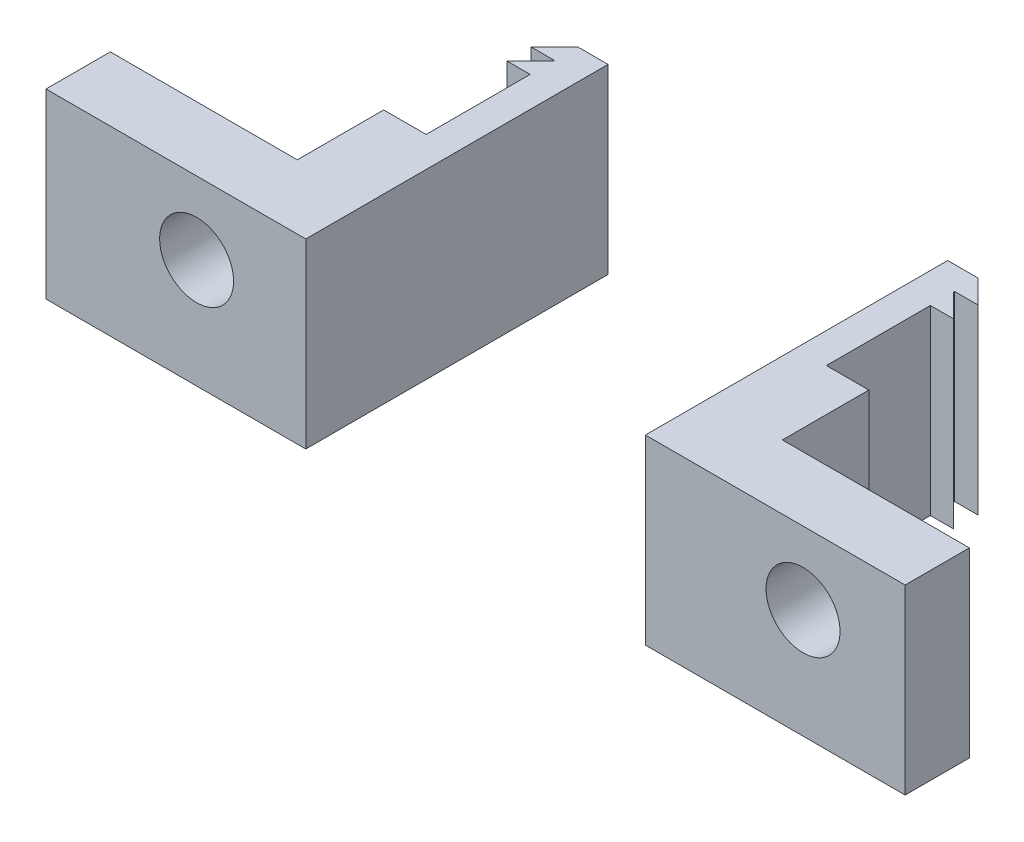
ISO-10303-21;
HEADER;
FILE_DESCRIPTION(('STEP AP214'),'2;1');
FILE_NAME('part.step','',(''),(''),'','','');
FILE_SCHEMA(('AUTOMOTIVE_DESIGN { 1 0 10303 214 1 1 1 1 }'));
ENDSEC;
DATA;
#1=APPLICATION_CONTEXT('core data for automotive mechanical design processes');
#2=APPLICATION_PROTOCOL_DEFINITION('international standard','automotive_design',2000,#1);
#3=PRODUCT_CONTEXT('',#1,'mechanical');
#4=PRODUCT('Part','Part','',(#3));
#5=PRODUCT_RELATED_PRODUCT_CATEGORY('part','',(#4));
#6=PRODUCT_DEFINITION_FORMATION('','',#4);
#7=PRODUCT_DEFINITION_CONTEXT('part definition',#1,'design');
#8=PRODUCT_DEFINITION('design','',#6,#7);
#9=PRODUCT_DEFINITION_SHAPE('','',#8);
#10=(LENGTH_UNIT() NAMED_UNIT(*) SI_UNIT(.MILLI.,.METRE.));
#11=(NAMED_UNIT(*) PLANE_ANGLE_UNIT() SI_UNIT($,.RADIAN.));
#12=(NAMED_UNIT(*) SI_UNIT($,.STERADIAN.) SOLID_ANGLE_UNIT());
#13=UNCERTAINTY_MEASURE_WITH_UNIT(LENGTH_MEASURE(1.E-05),#10,'distance_accuracy_value','');
#14=(GEOMETRIC_REPRESENTATION_CONTEXT(3) GLOBAL_UNCERTAINTY_ASSIGNED_CONTEXT((#13)) GLOBAL_UNIT_ASSIGNED_CONTEXT((#10,
#11,#12)) REPRESENTATION_CONTEXT('',''));
#15=CARTESIAN_POINT('',(0.,0.,0.));
#16=DIRECTION('',(0.,0.,1.));
#17=DIRECTION('',(1.,0.,0.));
#18=AXIS2_PLACEMENT_3D('',#15,#16,#17);
#19=CARTESIAN_POINT('',(16.5,15.,35.6989528795811));
#20=DIRECTION('',(-1.,0.,0.));
#21=DIRECTION('',(0.,0.,1.));
#22=AXIS2_PLACEMENT_3D('',#19,#20,#21);
#23=PLANE('',#22);
#24=DIRECTION('',(0.,-1.,0.));
#25=VECTOR('',#24,1.);
#26=CARTESIAN_POINT('',(16.5,15.,28.575));
#27=LINE('',#26,#25);
#28=CARTESIAN_POINT('',(16.5,15.,28.575));
#29=VERTEX_POINT('',#28);
#30=CARTESIAN_POINT('',(16.5,0.,28.575));
#31=VERTEX_POINT('',#30);
#32=EDGE_CURVE('E281',#29,#31,#27,.T.);
#33=ORIENTED_EDGE('',*,*,#32,.F.);
#34=DIRECTION('',(0.,0.,-1.));
#35=VECTOR('',#34,1.);
#36=CARTESIAN_POINT('',(16.5,15.,35.6989528795811));
#37=LINE('',#36,#35);
#38=CARTESIAN_POINT('',(16.5,15.,35.6989528795811));
#39=VERTEX_POINT('',#38);
#40=EDGE_CURVE('E239',#39,#29,#37,.T.);
#41=ORIENTED_EDGE('',*,*,#40,.F.);
#42=DIRECTION('',(0.,-1.,0.));
#43=VECTOR('',#42,1.);
#44=CARTESIAN_POINT('',(16.5,15.,35.6989528795811));
#45=LINE('',#44,#43);
#46=CARTESIAN_POINT('',(16.5,0.,35.6989528795811));
#47=VERTEX_POINT('',#46);
#48=EDGE_CURVE('E262',#39,#47,#45,.T.);
#49=ORIENTED_EDGE('',*,*,#48,.T.);
#50=DIRECTION('',(0.,0.,-1.));
#51=VECTOR('',#50,1.);
#52=CARTESIAN_POINT('',(16.5,0.,35.6989528795811));
#53=LINE('',#52,#51);
#54=EDGE_CURVE('E256',#47,#31,#53,.T.);
#55=ORIENTED_EDGE('',*,*,#54,.T.);
#56=EDGE_LOOP('',(#33,#41,#49,#55));
#57=FACE_BOUND('',#56,.T.);
#58=ADVANCED_FACE('F135',(#57),#23,.F.);
#59=CARTESIAN_POINT('',(0.,15.,0.));
#60=DIRECTION('',(0.,-1.,0.));
#61=DIRECTION('',(0.,0.,-1.));
#62=AXIS2_PLACEMENT_3D('',#59,#60,#61);
#63=PLANE('',#62);
#64=DIRECTION('',(-1.,0.,0.));
#65=VECTOR('',#64,1.);
#66=CARTESIAN_POINT('',(0.,15.,28.575));
#67=LINE('',#66,#65);
#68=CARTESIAN_POINT('',(13.,15.,28.575));
#69=VERTEX_POINT('',#68);
#70=EDGE_CURVE('E253',#29,#69,#67,.T.);
#71=ORIENTED_EDGE('',*,*,#70,.T.);
#72=DIRECTION('',(0.,0.,1.));
#73=VECTOR('',#72,1.);
#74=CARTESIAN_POINT('',(12.9999999999999,15.,20.));
#75=LINE('',#74,#73);
#76=CARTESIAN_POINT('',(12.9999999999999,15.,20.));
#77=VERTEX_POINT('',#76);
#78=EDGE_CURVE('E229',#77,#69,#75,.T.);
#79=ORIENTED_EDGE('',*,*,#78,.F.);
#80=DIRECTION('',(-1.,0.,0.));
#81=VECTOR('',#80,1.);
#82=CARTESIAN_POINT('',(14.9249999999999,15.,20.));
#83=LINE('',#82,#81);
#84=CARTESIAN_POINT('',(14.9249999999999,15.,20.));
#85=VERTEX_POINT('',#84);
#86=EDGE_CURVE('E225',#85,#77,#83,.T.);
#87=ORIENTED_EDGE('',*,*,#86,.F.);
#88=DIRECTION('',(0.707106781186564,0.,0.707106781186531));
#89=VECTOR('',#88,1.);
#90=CARTESIAN_POINT('',(13.,15.,18.0750000000002));
#91=LINE('',#90,#89);
#92=CARTESIAN_POINT('',(13.,15.,18.0750000000002));
#93=VERTEX_POINT('',#92);
#94=EDGE_CURVE('E287',#93,#85,#91,.T.);
#95=ORIENTED_EDGE('',*,*,#94,.F.);
#96=DIRECTION('',(1.06396373192931E-12,0.,1.));
#97=VECTOR('',#96,1.);
#98=CARTESIAN_POINT('',(12.9999999999999,15.,18.));
#99=LINE('',#98,#97);
#100=CARTESIAN_POINT('',(12.9999999999999,15.,18.));
#101=VERTEX_POINT('',#100);
#102=EDGE_CURVE('E290',#101,#93,#99,.T.);
#103=ORIENTED_EDGE('',*,*,#102,.F.);
#104=DIRECTION('',(-1.,0.,0.));
#105=VECTOR('',#104,1.);
#106=CARTESIAN_POINT('',(14.9249999999999,15.,18.));
#107=LINE('',#106,#105);
#108=CARTESIAN_POINT('',(14.9249999999999,15.,18.));
#109=VERTEX_POINT('',#108);
#110=EDGE_CURVE('E293',#109,#101,#107,.T.);
#111=ORIENTED_EDGE('',*,*,#110,.F.);
#112=DIRECTION('',(0.707106781186563,0.,0.707106781186532));
#113=VECTOR('',#112,1.);
#114=CARTESIAN_POINT('',(13.,15.,16.0750000000002));
#115=LINE('',#114,#113);
#116=CARTESIAN_POINT('',(13.,15.,16.0750000000002));
#117=VERTEX_POINT('',#116);
#118=EDGE_CURVE('E145',#117,#109,#115,.T.);
#119=ORIENTED_EDGE('',*,*,#118,.F.);
#120=DIRECTION('',(1.,0.,0.));
#121=VECTOR('',#120,1.);
#122=CARTESIAN_POINT('',(-20.,15.,16.0750000000002));
#123=LINE('',#122,#121);
#124=CARTESIAN_POINT('',(10.5,15.,16.0750000000002));
#125=VERTEX_POINT('',#124);
#126=EDGE_CURVE('E139',#125,#117,#123,.T.);
#127=ORIENTED_EDGE('',*,*,#126,.F.);
#128=DIRECTION('',(0.,0.,-1.));
#129=VECTOR('',#128,1.);
#130=CARTESIAN_POINT('',(10.5,15.,41.));
#131=LINE('',#130,#129);
#132=CARTESIAN_POINT('',(10.5,15.,41.));
#133=VERTEX_POINT('',#132);
#134=EDGE_CURVE('E379',#133,#125,#131,.T.);
#135=ORIENTED_EDGE('',*,*,#134,.F.);
#136=DIRECTION('',(1.,0.,0.));
#137=VECTOR('',#136,1.);
#138=CARTESIAN_POINT('',(11.5,15.,41.));
#139=LINE('',#138,#137);
#140=CARTESIAN_POINT('',(31.9173098006345,15.,41.));
#141=VERTEX_POINT('',#140);
#142=EDGE_CURVE('E255',#133,#141,#139,.T.);
#143=ORIENTED_EDGE('',*,*,#142,.T.);
#144=DIRECTION('',(0.,0.,-1.));
#145=VECTOR('',#144,1.);
#146=CARTESIAN_POINT('',(31.9173098006345,15.,41.));
#147=LINE('',#146,#145);
#148=CARTESIAN_POINT('',(31.9173098006345,15.,35.6989528795811));
#149=VERTEX_POINT('',#148);
#150=EDGE_CURVE('E259',#141,#149,#147,.T.);
#151=ORIENTED_EDGE('',*,*,#150,.T.);
#152=DIRECTION('',(-1.,0.,0.));
#153=VECTOR('',#152,1.);
#154=CARTESIAN_POINT('',(31.9173098006345,15.,35.6989528795811));
#155=LINE('',#154,#153);
#156=EDGE_CURVE('E273',#149,#39,#155,.T.);
#157=ORIENTED_EDGE('',*,*,#156,.T.);
#158=ORIENTED_EDGE('',*,*,#40,.T.);
#159=EDGE_LOOP('',(#71,#79,#87,#95,#103,#111,#119,#127,#135,#143,#151,#157,#158));
#160=FACE_BOUND('',#159,.T.);
#161=ADVANCED_FACE('F320',(#160),#63,.F.);
#162=CARTESIAN_POINT('',(0.,0.,0.));
#163=DIRECTION('',(0.,-1.,0.));
#164=DIRECTION('',(0.,0.,-1.));
#165=AXIS2_PLACEMENT_3D('',#162,#163,#164);
#166=PLANE('',#165);
#167=DIRECTION('',(0.,0.,1.));
#168=VECTOR('',#167,1.);
#169=CARTESIAN_POINT('',(12.9999999999999,0.,20.));
#170=LINE('',#169,#168);
#171=CARTESIAN_POINT('',(12.9999999999999,0.,20.));
#172=VERTEX_POINT('',#171);
#173=CARTESIAN_POINT('',(13.,0.,28.575));
#174=VERTEX_POINT('',#173);
#175=EDGE_CURVE('E233',#172,#174,#170,.T.);
#176=ORIENTED_EDGE('',*,*,#175,.T.);
#177=DIRECTION('',(1.,0.,0.));
#178=VECTOR('',#177,1.);
#179=CARTESIAN_POINT('',(0.,0.,28.575));
#180=LINE('',#179,#178);
#181=EDGE_CURVE('E238',#174,#31,#180,.T.);
#182=ORIENTED_EDGE('',*,*,#181,.T.);
#183=ORIENTED_EDGE('',*,*,#54,.F.);
#184=DIRECTION('',(-1.,0.,0.));
#185=VECTOR('',#184,1.);
#186=CARTESIAN_POINT('',(31.9173098006345,0.,35.6989528795811));
#187=LINE('',#186,#185);
#188=CARTESIAN_POINT('',(31.9173098006345,0.,35.6989528795811));
#189=VERTEX_POINT('',#188);
#190=EDGE_CURVE('E245',#189,#47,#187,.T.);
#191=ORIENTED_EDGE('',*,*,#190,.F.);
#192=DIRECTION('',(0.,0.,-1.));
#193=VECTOR('',#192,1.);
#194=CARTESIAN_POINT('',(31.9173098006345,0.,41.));
#195=LINE('',#194,#193);
#196=CARTESIAN_POINT('',(31.9173098006345,0.,41.));
#197=VERTEX_POINT('',#196);
#198=EDGE_CURVE('E397',#197,#189,#195,.T.);
#199=ORIENTED_EDGE('',*,*,#198,.F.);
#200=DIRECTION('',(1.,0.,0.));
#201=VECTOR('',#200,1.);
#202=CARTESIAN_POINT('',(11.5,0.,41.));
#203=LINE('',#202,#201);
#204=CARTESIAN_POINT('',(10.5,0.,41.));
#205=VERTEX_POINT('',#204);
#206=EDGE_CURVE('E270',#205,#197,#203,.T.);
#207=ORIENTED_EDGE('',*,*,#206,.F.);
#208=DIRECTION('',(0.,0.,1.));
#209=VECTOR('',#208,1.);
#210=CARTESIAN_POINT('',(10.5,0.,41.));
#211=LINE('',#210,#209);
#212=CARTESIAN_POINT('',(10.5,0.,16.0750000000002));
#213=VERTEX_POINT('',#212);
#214=EDGE_CURVE('E267',#213,#205,#211,.T.);
#215=ORIENTED_EDGE('',*,*,#214,.F.);
#216=DIRECTION('',(-1.,0.,0.));
#217=VECTOR('',#216,1.);
#218=CARTESIAN_POINT('',(13.,0.,16.0750000000002));
#219=LINE('',#218,#217);
#220=CARTESIAN_POINT('',(13.,0.,16.0750000000002));
#221=VERTEX_POINT('',#220);
#222=EDGE_CURVE('E306',#221,#213,#219,.T.);
#223=ORIENTED_EDGE('',*,*,#222,.F.);
#224=DIRECTION('',(0.707106781186563,0.,0.707106781186532));
#225=VECTOR('',#224,1.);
#226=CARTESIAN_POINT('',(13.,0.,16.0750000000002));
#227=LINE('',#226,#225);
#228=CARTESIAN_POINT('',(14.9249999999999,0.,18.));
#229=VERTEX_POINT('',#228);
#230=EDGE_CURVE('E153',#221,#229,#227,.T.);
#231=ORIENTED_EDGE('',*,*,#230,.T.);
#232=DIRECTION('',(-1.,0.,0.));
#233=VECTOR('',#232,1.);
#234=CARTESIAN_POINT('',(14.9249999999999,0.,18.));
#235=LINE('',#234,#233);
#236=CARTESIAN_POINT('',(12.9999999999999,0.,18.));
#237=VERTEX_POINT('',#236);
#238=EDGE_CURVE('E310',#229,#237,#235,.T.);
#239=ORIENTED_EDGE('',*,*,#238,.T.);
#240=DIRECTION('',(1.06396373192931E-12,0.,1.));
#241=VECTOR('',#240,1.);
#242=CARTESIAN_POINT('',(12.9999999999999,0.,18.));
#243=LINE('',#242,#241);
#244=CARTESIAN_POINT('',(13.,0.,18.0750000000002));
#245=VERTEX_POINT('',#244);
#246=EDGE_CURVE('E250',#237,#245,#243,.T.);
#247=ORIENTED_EDGE('',*,*,#246,.T.);
#248=DIRECTION('',(0.707106781186564,0.,0.707106781186531));
#249=VECTOR('',#248,1.);
#250=CARTESIAN_POINT('',(13.,0.,18.0750000000002));
#251=LINE('',#250,#249);
#252=CARTESIAN_POINT('',(14.9249999999999,0.,20.));
#253=VERTEX_POINT('',#252);
#254=EDGE_CURVE('E244',#245,#253,#251,.T.);
#255=ORIENTED_EDGE('',*,*,#254,.T.);
#256=DIRECTION('',(-1.,0.,0.));
#257=VECTOR('',#256,1.);
#258=CARTESIAN_POINT('',(14.9249999999999,0.,20.));
#259=LINE('',#258,#257);
#260=EDGE_CURVE('E222',#253,#172,#259,.T.);
#261=ORIENTED_EDGE('',*,*,#260,.T.);
#262=EDGE_LOOP('',(#176,#182,#183,#191,#199,#207,#215,#223,#231,#239,#247,#255,#261));
#263=FACE_BOUND('',#262,.T.);
#264=ADVANCED_FACE('F241',(#263),#166,.T.);
#265=CARTESIAN_POINT('',(31.9173098006345,15.,35.6989528795811));
#266=DIRECTION('',(0.,0.,1.));
#267=DIRECTION('',(1.,0.,0.));
#268=AXIS2_PLACEMENT_3D('',#265,#266,#267);
#269=PLANE('',#268);
#270=CARTESIAN_POINT('',(23.5,9.,35.6989528795811));
#271=DIRECTION('',(0.,0.,-1.));
#272=DIRECTION('',(-1.,0.,0.));
#273=AXIS2_PLACEMENT_3D('',#270,#271,#272);
#274=CIRCLE('',#273,3.05);
#275=CARTESIAN_POINT('',(20.45,9.,35.6989528795811));
#276=VERTEX_POINT('',#275);
#277=EDGE_CURVE('E278',#276,#276,#274,.T.);
#278=ORIENTED_EDGE('',*,*,#277,.F.);
#279=EDGE_LOOP('',(#278));
#280=FACE_BOUND('',#279,.T.);
#281=ORIENTED_EDGE('',*,*,#190,.T.);
#282=ORIENTED_EDGE('',*,*,#48,.F.);
#283=ORIENTED_EDGE('',*,*,#156,.F.);
#284=DIRECTION('',(0.,-1.,0.));
#285=VECTOR('',#284,1.);
#286=CARTESIAN_POINT('',(31.9173098006345,15.,35.6989528795811));
#287=LINE('',#286,#285);
#288=EDGE_CURVE('E248',#149,#189,#287,.T.);
#289=ORIENTED_EDGE('',*,*,#288,.T.);
#290=EDGE_LOOP('',(#281,#282,#283,#289));
#291=FACE_BOUND('',#290,.T.);
#292=ADVANCED_FACE('F327',(#280,#291),#269,.F.);
#293=CARTESIAN_POINT('',(11.5,15.,41.));
#294=DIRECTION('',(0.,0.,-1.));
#295=DIRECTION('',(-1.,0.,0.));
#296=AXIS2_PLACEMENT_3D('',#293,#294,#295);
#297=PLANE('',#296);
#298=CARTESIAN_POINT('',(23.5,9.,41.));
#299=DIRECTION('',(0.,0.,-1.));
#300=DIRECTION('',(-1.,0.,0.));
#301=AXIS2_PLACEMENT_3D('',#298,#299,#300);
#302=CIRCLE('',#301,3.05);
#303=CARTESIAN_POINT('',(20.45,9.,41.));
#304=VERTEX_POINT('',#303);
#305=EDGE_CURVE('E392',#304,#304,#302,.T.);
#306=ORIENTED_EDGE('',*,*,#305,.T.);
#307=EDGE_LOOP('',(#306));
#308=FACE_BOUND('',#307,.T.);
#309=ORIENTED_EDGE('',*,*,#206,.T.);
#310=DIRECTION('',(0.,-1.,0.));
#311=VECTOR('',#310,1.);
#312=CARTESIAN_POINT('',(31.9173098006345,15.,41.));
#313=LINE('',#312,#311);
#314=EDGE_CURVE('E282',#141,#197,#313,.T.);
#315=ORIENTED_EDGE('',*,*,#314,.F.);
#316=ORIENTED_EDGE('',*,*,#142,.F.);
#317=DIRECTION('',(0.,1.,0.));
#318=VECTOR('',#317,1.);
#319=CARTESIAN_POINT('',(10.5,0.,41.));
#320=LINE('',#319,#318);
#321=EDGE_CURVE('E375',#205,#133,#320,.T.);
#322=ORIENTED_EDGE('',*,*,#321,.F.);
#323=EDGE_LOOP('',(#309,#315,#316,#322));
#324=FACE_BOUND('',#323,.T.);
#325=ADVANCED_FACE('F358',(#308,#324),#297,.F.);
#326=CARTESIAN_POINT('',(31.9173098006345,15.,41.));
#327=DIRECTION('',(-1.,0.,0.));
#328=DIRECTION('',(0.,0.,1.));
#329=AXIS2_PLACEMENT_3D('',#326,#327,#328);
#330=PLANE('',#329);
#331=ORIENTED_EDGE('',*,*,#198,.T.);
#332=ORIENTED_EDGE('',*,*,#288,.F.);
#333=ORIENTED_EDGE('',*,*,#150,.F.);
#334=ORIENTED_EDGE('',*,*,#314,.T.);
#335=EDGE_LOOP('',(#331,#332,#333,#334));
#336=FACE_BOUND('',#335,.T.);
#337=ADVANCED_FACE('F354',(#336),#330,.F.);
#338=CARTESIAN_POINT('',(23.5,9.,50.6989528795811));
#339=DIRECTION('',(0.,0.,-1.));
#340=DIRECTION('',(-1.,0.,0.));
#341=AXIS2_PLACEMENT_3D('',#338,#339,#340);
#342=CYLINDRICAL_SURFACE('',#341,3.05);
#343=ORIENTED_EDGE('',*,*,#277,.T.);
#344=EDGE_LOOP('',(#343));
#345=FACE_BOUND('',#344,.T.);
#346=ORIENTED_EDGE('',*,*,#305,.F.);
#347=EDGE_LOOP('',(#346));
#348=FACE_BOUND('',#347,.T.);
#349=ADVANCED_FACE('F334',(#345,#348),#342,.F.);
#350=CARTESIAN_POINT('',(0.,0.,28.575));
#351=DIRECTION('',(0.,0.,-1.));
#352=DIRECTION('',(-1.,0.,0.));
#353=AXIS2_PLACEMENT_3D('',#350,#351,#352);
#354=PLANE('',#353);
#355=ORIENTED_EDGE('',*,*,#32,.T.);
#356=ORIENTED_EDGE('',*,*,#181,.F.);
#357=DIRECTION('',(0.,1.,0.));
#358=VECTOR('',#357,1.);
#359=CARTESIAN_POINT('',(13.,0.,28.575));
#360=LINE('',#359,#358);
#361=EDGE_CURVE('E235',#174,#69,#360,.T.);
#362=ORIENTED_EDGE('',*,*,#361,.T.);
#363=ORIENTED_EDGE('',*,*,#70,.F.);
#364=EDGE_LOOP('',(#355,#356,#362,#363));
#365=FACE_BOUND('',#364,.T.);
#366=ADVANCED_FACE('F331',(#365),#354,.T.);
#367=CARTESIAN_POINT('',(-20.,0.,16.0750000000002));
#368=DIRECTION('',(0.,0.,1.));
#369=DIRECTION('',(1.,0.,0.));
#370=AXIS2_PLACEMENT_3D('',#367,#368,#369);
#371=PLANE('',#370);
#372=ORIENTED_EDGE('',*,*,#126,.T.);
#373=DIRECTION('',(0.,1.,0.));
#374=VECTOR('',#373,1.);
#375=CARTESIAN_POINT('',(13.,0.,16.0750000000002));
#376=LINE('',#375,#374);
#377=EDGE_CURVE('E13',#221,#117,#376,.T.);
#378=ORIENTED_EDGE('',*,*,#377,.F.);
#379=ORIENTED_EDGE('',*,*,#222,.T.);
#380=DIRECTION('',(0.,-1.,0.));
#381=VECTOR('',#380,1.);
#382=CARTESIAN_POINT('',(10.5,0.,16.0750000000002));
#383=LINE('',#382,#381);
#384=EDGE_CURVE('E386',#125,#213,#383,.T.);
#385=ORIENTED_EDGE('',*,*,#384,.F.);
#386=EDGE_LOOP('',(#372,#378,#379,#385));
#387=FACE_BOUND('',#386,.T.);
#388=ADVANCED_FACE('F137',(#387),#371,.F.);
#389=CARTESIAN_POINT('',(12.9999999999999,0.,20.));
#390=DIRECTION('',(-1.,0.,0.));
#391=DIRECTION('',(0.,0.,1.));
#392=AXIS2_PLACEMENT_3D('',#389,#390,#391);
#393=PLANE('',#392);
#394=ORIENTED_EDGE('',*,*,#78,.T.);
#395=ORIENTED_EDGE('',*,*,#361,.F.);
#396=ORIENTED_EDGE('',*,*,#175,.F.);
#397=DIRECTION('',(0.,1.,0.));
#398=VECTOR('',#397,1.);
#399=CARTESIAN_POINT('',(12.9999999999999,0.,20.));
#400=LINE('',#399,#398);
#401=EDGE_CURVE('E218',#172,#77,#400,.T.);
#402=ORIENTED_EDGE('',*,*,#401,.T.);
#403=EDGE_LOOP('',(#394,#395,#396,#402));
#404=FACE_BOUND('',#403,.T.);
#405=ADVANCED_FACE('F234',(#404),#393,.F.);
#406=CARTESIAN_POINT('',(14.9249999999999,0.,20.));
#407=DIRECTION('',(0.,0.,-1.));
#408=DIRECTION('',(-1.,0.,0.));
#409=AXIS2_PLACEMENT_3D('',#406,#407,#408);
#410=PLANE('',#409);
#411=ORIENTED_EDGE('',*,*,#86,.T.);
#412=ORIENTED_EDGE('',*,*,#401,.F.);
#413=ORIENTED_EDGE('',*,*,#260,.F.);
#414=DIRECTION('',(0.,1.,0.));
#415=VECTOR('',#414,1.);
#416=CARTESIAN_POINT('',(14.9249999999999,0.,20.));
#417=LINE('',#416,#415);
#418=EDGE_CURVE('E285',#253,#85,#417,.T.);
#419=ORIENTED_EDGE('',*,*,#418,.T.);
#420=EDGE_LOOP('',(#411,#412,#413,#419));
#421=FACE_BOUND('',#420,.T.);
#422=ADVANCED_FACE('F220',(#421),#410,.F.);
#423=CARTESIAN_POINT('',(13.,0.,18.0750000000002));
#424=DIRECTION('',(-0.707106781186531,0.,0.707106781186564));
#425=DIRECTION('',(0.707106781186564,0.,0.707106781186531));
#426=AXIS2_PLACEMENT_3D('',#423,#424,#425);
#427=PLANE('',#426);
#428=ORIENTED_EDGE('',*,*,#94,.T.);
#429=ORIENTED_EDGE('',*,*,#418,.F.);
#430=ORIENTED_EDGE('',*,*,#254,.F.);
#431=DIRECTION('',(0.,1.,0.));
#432=VECTOR('',#431,1.);
#433=CARTESIAN_POINT('',(13.,0.,18.0750000000002));
#434=LINE('',#433,#432);
#435=EDGE_CURVE('E288',#245,#93,#434,.T.);
#436=ORIENTED_EDGE('',*,*,#435,.T.);
#437=EDGE_LOOP('',(#428,#429,#430,#436));
#438=FACE_BOUND('',#437,.T.);
#439=ADVANCED_FACE('F319',(#438),#427,.F.);
#440=CARTESIAN_POINT('',(12.9999999999999,0.,18.));
#441=DIRECTION('',(-1.,0.,1.06396373192931E-12));
#442=DIRECTION('',(1.06396373192931E-12,0.,1.));
#443=AXIS2_PLACEMENT_3D('',#440,#441,#442);
#444=PLANE('',#443);
#445=ORIENTED_EDGE('',*,*,#102,.T.);
#446=ORIENTED_EDGE('',*,*,#435,.F.);
#447=ORIENTED_EDGE('',*,*,#246,.F.);
#448=DIRECTION('',(0.,1.,0.));
#449=VECTOR('',#448,1.);
#450=CARTESIAN_POINT('',(12.9999999999999,0.,18.));
#451=LINE('',#450,#449);
#452=EDGE_CURVE('E291',#237,#101,#451,.T.);
#453=ORIENTED_EDGE('',*,*,#452,.T.);
#454=EDGE_LOOP('',(#445,#446,#447,#453));
#455=FACE_BOUND('',#454,.T.);
#456=ADVANCED_FACE('F315',(#455),#444,.F.);
#457=CARTESIAN_POINT('',(14.9249999999999,0.,18.));
#458=DIRECTION('',(0.,0.,-1.));
#459=DIRECTION('',(-1.,0.,0.));
#460=AXIS2_PLACEMENT_3D('',#457,#458,#459);
#461=PLANE('',#460);
#462=ORIENTED_EDGE('',*,*,#110,.T.);
#463=ORIENTED_EDGE('',*,*,#452,.F.);
#464=ORIENTED_EDGE('',*,*,#238,.F.);
#465=DIRECTION('',(0.,1.,0.));
#466=VECTOR('',#465,1.);
#467=CARTESIAN_POINT('',(14.9249999999999,0.,18.));
#468=LINE('',#467,#466);
#469=EDGE_CURVE('E294',#229,#109,#468,.T.);
#470=ORIENTED_EDGE('',*,*,#469,.T.);
#471=EDGE_LOOP('',(#462,#463,#464,#470));
#472=FACE_BOUND('',#471,.T.);
#473=ADVANCED_FACE('F340',(#472),#461,.F.);
#474=CARTESIAN_POINT('',(13.,0.,16.0750000000002));
#475=DIRECTION('',(-0.707106781186532,0.,0.707106781186563));
#476=DIRECTION('',(0.707106781186563,0.,0.707106781186532));
#477=AXIS2_PLACEMENT_3D('',#474,#475,#476);
#478=PLANE('',#477);
#479=ORIENTED_EDGE('',*,*,#118,.T.);
#480=ORIENTED_EDGE('',*,*,#469,.F.);
#481=ORIENTED_EDGE('',*,*,#230,.F.);
#482=ORIENTED_EDGE('',*,*,#377,.T.);
#483=EDGE_LOOP('',(#479,#480,#481,#482));
#484=FACE_BOUND('',#483,.T.);
#485=ADVANCED_FACE('F336',(#484),#478,.F.);
#486=CARTESIAN_POINT('',(10.5,0.,0.));
#487=DIRECTION('',(-1.,0.,0.));
#488=DIRECTION('',(0.,0.,1.));
#489=AXIS2_PLACEMENT_3D('',#486,#487,#488);
#490=PLANE('',#489);
#491=ORIENTED_EDGE('',*,*,#321,.T.);
#492=ORIENTED_EDGE('',*,*,#134,.T.);
#493=ORIENTED_EDGE('',*,*,#384,.T.);
#494=ORIENTED_EDGE('',*,*,#214,.T.);
#495=EDGE_LOOP('',(#491,#492,#493,#494));
#496=FACE_BOUND('',#495,.T.);
#497=ADVANCED_FACE('F339',(#496),#490,.T.);
#498=CLOSED_SHELL('',(#58,#161,#264,#292,#325,#337,#349,#366,#388,#405,#422,#439,#456,#473,#485,#497));
#499=MANIFOLD_SOLID_BREP('B2',#498);
#500=CARTESIAN_POINT('',(-23.5,15.,-5.));
#501=DIRECTION('',(1.,0.,0.));
#502=DIRECTION('',(0.,0.,-1.));
#503=AXIS2_PLACEMENT_3D('',#500,#501,#502);
#504=PLANE('',#503);
#505=DIRECTION('',(0.,0.,1.));
#506=VECTOR('',#505,1.);
#507=CARTESIAN_POINT('',(-23.5,14.1961524227066,25.6989528795811));
#508=LINE('',#507,#506);
#509=CARTESIAN_POINT('',(-23.5,14.1961524227066,35.6989528795811));
#510=VERTEX_POINT('',#509);
#511=CARTESIAN_POINT('',(-23.5,14.1961524227066,28.575));
#512=VERTEX_POINT('',#511);
#513=EDGE_CURVE('E552',#510,#512,#508,.F.);
#514=ORIENTED_EDGE('',*,*,#513,.F.);
#515=DIRECTION('',(0.,-1.,0.));
#516=VECTOR('',#515,1.);
#517=CARTESIAN_POINT('',(-23.5,15.,35.6989528795811));
#518=LINE('',#517,#516);
#519=CARTESIAN_POINT('',(-23.5,15.,35.6989528795811));
#520=VERTEX_POINT('',#519);
#521=EDGE_CURVE('E758',#520,#510,#518,.T.);
#522=ORIENTED_EDGE('',*,*,#521,.F.);
#523=DIRECTION('',(0.,0.,1.));
#524=VECTOR('',#523,1.);
#525=CARTESIAN_POINT('',(-23.5,15.,-5.));
#526=LINE('',#525,#524);
#527=CARTESIAN_POINT('',(-23.5,15.,28.575));
#528=VERTEX_POINT('',#527);
#529=EDGE_CURVE('E654',#528,#520,#526,.T.);
#530=ORIENTED_EDGE('',*,*,#529,.F.);
#531=DIRECTION('',(0.,1.,0.));
#532=VECTOR('',#531,1.);
#533=CARTESIAN_POINT('',(-23.5,15.,28.575));
#534=LINE('',#533,#532);
#535=EDGE_CURVE('E684',#512,#528,#534,.T.);
#536=ORIENTED_EDGE('',*,*,#535,.F.);
#537=EDGE_LOOP('',(#514,#522,#530,#536));
#538=FACE_BOUND('',#537,.T.);
#539=ADVANCED_FACE('F538',(#538),#504,.F.);
#540=DIRECTION('',(0.,0.,1.));
#541=VECTOR('',#540,1.);
#542=CARTESIAN_POINT('',(-23.5,3.80384757729337,25.6989528795811));
#543=LINE('',#542,#541);
#544=CARTESIAN_POINT('',(-23.5,3.80384757729337,28.575));
#545=VERTEX_POINT('',#544);
#546=CARTESIAN_POINT('',(-23.5,3.80384757729337,35.6989528795811));
#547=VERTEX_POINT('',#546);
#548=EDGE_CURVE('E678',#545,#547,#543,.T.);
#549=ORIENTED_EDGE('',*,*,#548,.F.);
#550=CARTESIAN_POINT('',(-23.5,0.,28.575));
#551=VERTEX_POINT('',#550);
#552=EDGE_CURVE('E733',#551,#545,#534,.T.);
#553=ORIENTED_EDGE('',*,*,#552,.F.);
#554=DIRECTION('',(0.,0.,1.));
#555=VECTOR('',#554,1.);
#556=CARTESIAN_POINT('',(-23.5,0.,-5.));
#557=LINE('',#556,#555);
#558=CARTESIAN_POINT('',(-23.5,0.,35.6989528795811));
#559=VERTEX_POINT('',#558);
#560=EDGE_CURVE('E747',#551,#559,#557,.T.);
#561=ORIENTED_EDGE('',*,*,#560,.T.);
#562=EDGE_CURVE('E757',#547,#559,#518,.T.);
#563=ORIENTED_EDGE('',*,*,#562,.F.);
#564=EDGE_LOOP('',(#549,#553,#561,#563));
#565=FACE_BOUND('',#564,.T.);
#566=ADVANCED_FACE('F798',(#565),#504,.F.);
#567=CARTESIAN_POINT('',(-26.5,9.,50.6989528795811));
#568=DIRECTION('',(0.,0.,-1.));
#569=DIRECTION('',(-1.,0.,0.));
#570=AXIS2_PLACEMENT_3D('',#567,#568,#569);
#571=CYLINDRICAL_SURFACE('',#570,3.05);
#572=CARTESIAN_POINT('',(-26.5,9.,35.6989528795811));
#573=DIRECTION('',(0.,0.,-1.));
#574=DIRECTION('',(-1.,0.,0.));
#575=AXIS2_PLACEMENT_3D('',#572,#573,#574);
#576=CIRCLE('',#575,3.05);
#577=CARTESIAN_POINT('',(-29.55,9.,35.6989528795811));
#578=VERTEX_POINT('',#577);
#579=EDGE_CURVE('E736',#578,#578,#576,.T.);
#580=ORIENTED_EDGE('',*,*,#579,.T.);
#581=EDGE_LOOP('',(#580));
#582=FACE_BOUND('',#581,.T.);
#583=CARTESIAN_POINT('',(-26.5,9.,41.));
#584=DIRECTION('',(0.,0.,-1.));
#585=DIRECTION('',(-1.,0.,0.));
#586=AXIS2_PLACEMENT_3D('',#583,#584,#585);
#587=CIRCLE('',#586,3.05);
#588=CARTESIAN_POINT('',(-29.55,9.,41.));
#589=VERTEX_POINT('',#588);
#590=EDGE_CURVE('E739',#589,#589,#587,.T.);
#591=ORIENTED_EDGE('',*,*,#590,.F.);
#592=EDGE_LOOP('',(#591));
#593=FACE_BOUND('',#592,.T.);
#594=ADVANCED_FACE('F827',(#582,#593),#571,.F.);
#595=CARTESIAN_POINT('',(-23.5,15.,35.6989528795811));
#596=DIRECTION('',(0.,0.,1.));
#597=DIRECTION('',(1.,0.,0.));
#598=AXIS2_PLACEMENT_3D('',#595,#596,#597);
#599=PLANE('',#598);
#600=ORIENTED_EDGE('',*,*,#521,.T.);
#601=CARTESIAN_POINT('',(-26.5,9.,35.6989528795811));
#602=DIRECTION('',(0.,0.,-1.));
#603=DIRECTION('',(-1.,0.,0.));
#604=AXIS2_PLACEMENT_3D('',#601,#602,#603);
#605=CIRCLE('',#604,5.99999999999999);
#606=EDGE_CURVE('E675',#510,#547,#605,.T.);
#607=ORIENTED_EDGE('',*,*,#606,.T.);
#608=ORIENTED_EDGE('',*,*,#562,.T.);
#609=DIRECTION('',(-1.,0.,0.));
#610=VECTOR('',#609,1.);
#611=CARTESIAN_POINT('',(-23.5,0.,35.6989528795811));
#612=LINE('',#611,#610);
#613=CARTESIAN_POINT('',(-38.9173098006345,0.,35.6989528795811));
#614=VERTEX_POINT('',#613);
#615=EDGE_CURVE('E750',#559,#614,#612,.T.);
#616=ORIENTED_EDGE('',*,*,#615,.T.);
#617=DIRECTION('',(0.,-1.,0.));
#618=VECTOR('',#617,1.);
#619=CARTESIAN_POINT('',(-38.9173098006345,15.,35.6989528795811));
#620=LINE('',#619,#618);
#621=CARTESIAN_POINT('',(-38.9173098006345,15.,35.6989528795811));
#622=VERTEX_POINT('',#621);
#623=EDGE_CURVE('E754',#622,#614,#620,.T.);
#624=ORIENTED_EDGE('',*,*,#623,.F.);
#625=DIRECTION('',(-1.,0.,0.));
#626=VECTOR('',#625,1.);
#627=CARTESIAN_POINT('',(-23.5,15.,35.6989528795811));
#628=LINE('',#627,#626);
#629=EDGE_CURVE('E741',#520,#622,#628,.T.);
#630=ORIENTED_EDGE('',*,*,#629,.F.);
#631=EDGE_LOOP('',(#600,#607,#608,#616,#624,#630));
#632=FACE_BOUND('',#631,.T.);
#633=ORIENTED_EDGE('',*,*,#579,.F.);
#634=EDGE_LOOP('',(#633));
#635=FACE_BOUND('',#634,.T.);
#636=ADVANCED_FACE('F792',(#632,#635),#599,.F.);
#637=CARTESIAN_POINT('',(-38.9173098006345,15.,35.6989528795811));
#638=DIRECTION('',(1.,0.,0.));
#639=DIRECTION('',(0.,0.,-1.));
#640=AXIS2_PLACEMENT_3D('',#637,#638,#639);
#641=PLANE('',#640);
#642=DIRECTION('',(0.,0.,1.));
#643=VECTOR('',#642,1.);
#644=CARTESIAN_POINT('',(-38.9173098006345,0.,35.6989528795811));
#645=LINE('',#644,#643);
#646=CARTESIAN_POINT('',(-38.9173098006345,0.,41.));
#647=VERTEX_POINT('',#646);
#648=EDGE_CURVE('E655',#614,#647,#645,.T.);
#649=ORIENTED_EDGE('',*,*,#648,.T.);
#650=DIRECTION('',(0.,-1.,0.));
#651=VECTOR('',#650,1.);
#652=CARTESIAN_POINT('',(-38.9173098006345,15.,41.));
#653=LINE('',#652,#651);
#654=CARTESIAN_POINT('',(-38.9173098006345,15.,41.));
#655=VERTEX_POINT('',#654);
#656=EDGE_CURVE('E651',#655,#647,#653,.T.);
#657=ORIENTED_EDGE('',*,*,#656,.F.);
#658=DIRECTION('',(0.,0.,1.));
#659=VECTOR('',#658,1.);
#660=CARTESIAN_POINT('',(-38.9173098006345,15.,35.6989528795811));
#661=LINE('',#660,#659);
#662=EDGE_CURVE('E743',#622,#655,#661,.T.);
#663=ORIENTED_EDGE('',*,*,#662,.F.);
#664=ORIENTED_EDGE('',*,*,#623,.T.);
#665=EDGE_LOOP('',(#649,#657,#663,#664));
#666=FACE_BOUND('',#665,.T.);
#667=ADVANCED_FACE('F788',(#666),#641,.F.);
#668=CARTESIAN_POINT('',(-38.9173098006345,15.,41.));
#669=DIRECTION('',(0.,0.,-1.));
#670=DIRECTION('',(-1.,0.,0.));
#671=AXIS2_PLACEMENT_3D('',#668,#669,#670);
#672=PLANE('',#671);
#673=ORIENTED_EDGE('',*,*,#590,.T.);
#674=EDGE_LOOP('',(#673));
#675=FACE_BOUND('',#674,.T.);
#676=DIRECTION('',(1.,0.,0.));
#677=VECTOR('',#676,1.);
#678=CARTESIAN_POINT('',(-38.9173098006345,0.,41.));
#679=LINE('',#678,#677);
#680=CARTESIAN_POINT('',(-17.5,0.,41.));
#681=VERTEX_POINT('',#680);
#682=EDGE_CURVE('E644',#647,#681,#679,.T.);
#683=ORIENTED_EDGE('',*,*,#682,.T.);
#684=DIRECTION('',(0.,-1.,0.));
#685=VECTOR('',#684,1.);
#686=CARTESIAN_POINT('',(-17.5,0.,41.));
#687=LINE('',#686,#685);
#688=CARTESIAN_POINT('',(-17.5,15.,41.));
#689=VERTEX_POINT('',#688);
#690=EDGE_CURVE('E649',#689,#681,#687,.T.);
#691=ORIENTED_EDGE('',*,*,#690,.F.);
#692=DIRECTION('',(1.,0.,0.));
#693=VECTOR('',#692,1.);
#694=CARTESIAN_POINT('',(-38.9173098006345,15.,41.));
#695=LINE('',#694,#693);
#696=EDGE_CURVE('E745',#655,#689,#695,.T.);
#697=ORIENTED_EDGE('',*,*,#696,.F.);
#698=ORIENTED_EDGE('',*,*,#656,.T.);
#699=EDGE_LOOP('',(#683,#691,#697,#698));
#700=FACE_BOUND('',#699,.T.);
#701=ADVANCED_FACE('F646',(#675,#700),#672,.F.);
#702=CARTESIAN_POINT('',(0.,15.,0.));
#703=DIRECTION('',(0.,-1.,0.));
#704=DIRECTION('',(0.,0.,-1.));
#705=AXIS2_PLACEMENT_3D('',#702,#703,#704);
#706=PLANE('',#705);
#707=DIRECTION('',(-1.,0.,0.));
#708=VECTOR('',#707,1.);
#709=CARTESIAN_POINT('',(0.,15.,28.575));
#710=LINE('',#709,#708);
#711=CARTESIAN_POINT('',(-20.,15.,28.575));
#712=VERTEX_POINT('',#711);
#713=EDGE_CURVE('E685',#712,#528,#710,.T.);
#714=ORIENTED_EDGE('',*,*,#713,.T.);
#715=ORIENTED_EDGE('',*,*,#529,.T.);
#716=ORIENTED_EDGE('',*,*,#629,.T.);
#717=ORIENTED_EDGE('',*,*,#662,.T.);
#718=ORIENTED_EDGE('',*,*,#696,.T.);
#719=DIRECTION('',(0.,0.,1.));
#720=VECTOR('',#719,1.);
#721=CARTESIAN_POINT('',(-17.5,15.,41.));
#722=LINE('',#721,#720);
#723=CARTESIAN_POINT('',(-17.5,15.,16.0750000000002));
#724=VERTEX_POINT('',#723);
#725=EDGE_CURVE('E670',#724,#689,#722,.T.);
#726=ORIENTED_EDGE('',*,*,#725,.F.);
#727=DIRECTION('',(1.,0.,0.));
#728=VECTOR('',#727,1.);
#729=CARTESIAN_POINT('',(-20.,15.,16.0750000000002));
#730=LINE('',#729,#728);
#731=CARTESIAN_POINT('',(-20.,15.,16.0750000000002));
#732=VERTEX_POINT('',#731);
#733=EDGE_CURVE('E681',#732,#724,#730,.T.);
#734=ORIENTED_EDGE('',*,*,#733,.F.);
#735=DIRECTION('',(-0.707106781186563,0.,0.707106781186532));
#736=VECTOR('',#735,1.);
#737=CARTESIAN_POINT('',(-20.,15.,16.0750000000002));
#738=LINE('',#737,#736);
#739=CARTESIAN_POINT('',(-21.9249999999999,15.,18.));
#740=VERTEX_POINT('',#739);
#741=EDGE_CURVE('E704',#732,#740,#738,.T.);
#742=ORIENTED_EDGE('',*,*,#741,.T.);
#743=DIRECTION('',(1.,0.,0.));
#744=VECTOR('',#743,1.);
#745=CARTESIAN_POINT('',(-21.9249999999999,15.,18.));
#746=LINE('',#745,#744);
#747=CARTESIAN_POINT('',(-19.9999999999999,15.,18.));
#748=VERTEX_POINT('',#747);
#749=EDGE_CURVE('E707',#740,#748,#746,.T.);
#750=ORIENTED_EDGE('',*,*,#749,.T.);
#751=DIRECTION('',(-1.06396373192931E-12,0.,1.));
#752=VECTOR('',#751,1.);
#753=CARTESIAN_POINT('',(-19.9999999999999,15.,18.));
#754=LINE('',#753,#752);
#755=CARTESIAN_POINT('',(-20.,15.,18.0750000000002));
#756=VERTEX_POINT('',#755);
#757=EDGE_CURVE('E710',#748,#756,#754,.T.);
#758=ORIENTED_EDGE('',*,*,#757,.T.);
#759=DIRECTION('',(-0.707106781186564,0.,0.707106781186531));
#760=VECTOR('',#759,1.);
#761=CARTESIAN_POINT('',(-20.,15.,18.0750000000002));
#762=LINE('',#761,#760);
#763=CARTESIAN_POINT('',(-21.9249999999999,15.,20.));
#764=VERTEX_POINT('',#763);
#765=EDGE_CURVE('E713',#756,#764,#762,.T.);
#766=ORIENTED_EDGE('',*,*,#765,.T.);
#767=DIRECTION('',(1.,0.,0.));
#768=VECTOR('',#767,1.);
#769=CARTESIAN_POINT('',(-21.9249999999999,15.,20.));
#770=LINE('',#769,#768);
#771=CARTESIAN_POINT('',(-19.9999999999999,15.,20.));
#772=VERTEX_POINT('',#771);
#773=EDGE_CURVE('E716',#764,#772,#770,.T.);
#774=ORIENTED_EDGE('',*,*,#773,.T.);
#775=DIRECTION('',(0.,0.,1.));
#776=VECTOR('',#775,1.);
#777=CARTESIAN_POINT('',(-19.9999999999999,15.,20.));
#778=LINE('',#777,#776);
#779=EDGE_CURVE('E692',#772,#712,#778,.T.);
#780=ORIENTED_EDGE('',*,*,#779,.T.);
#781=EDGE_LOOP('',(#714,#715,#716,#717,#718,#726,#734,#742,#750,#758,#766,#774,#780));
#782=FACE_BOUND('',#781,.T.);
#783=ADVANCED_FACE('F783',(#782),#706,.F.);
#784=CARTESIAN_POINT('',(0.,0.,0.));
#785=DIRECTION('',(0.,-1.,0.));
#786=DIRECTION('',(0.,0.,-1.));
#787=AXIS2_PLACEMENT_3D('',#784,#785,#786);
#788=PLANE('',#787);
#789=ORIENTED_EDGE('',*,*,#560,.F.);
#790=DIRECTION('',(-1.,0.,0.));
#791=VECTOR('',#790,1.);
#792=CARTESIAN_POINT('',(0.,0.,28.575));
#793=LINE('',#792,#791);
#794=CARTESIAN_POINT('',(-20.,0.,28.575));
#795=VERTEX_POINT('',#794);
#796=EDGE_CURVE('E682',#795,#551,#793,.T.);
#797=ORIENTED_EDGE('',*,*,#796,.F.);
#798=DIRECTION('',(0.,0.,1.));
#799=VECTOR('',#798,1.);
#800=CARTESIAN_POINT('',(-19.9999999999999,0.,20.));
#801=LINE('',#800,#799);
#802=CARTESIAN_POINT('',(-19.9999999999999,0.,20.));
#803=VERTEX_POINT('',#802);
#804=EDGE_CURVE('E700',#803,#795,#801,.T.);
#805=ORIENTED_EDGE('',*,*,#804,.F.);
#806=DIRECTION('',(1.,0.,0.));
#807=VECTOR('',#806,1.);
#808=CARTESIAN_POINT('',(-21.9249999999999,0.,20.));
#809=LINE('',#808,#807);
#810=CARTESIAN_POINT('',(-21.9249999999999,0.,20.));
#811=VERTEX_POINT('',#810);
#812=EDGE_CURVE('E698',#811,#803,#809,.T.);
#813=ORIENTED_EDGE('',*,*,#812,.F.);
#814=DIRECTION('',(-0.707106781186564,0.,0.707106781186531));
#815=VECTOR('',#814,1.);
#816=CARTESIAN_POINT('',(-20.,0.,18.0750000000002));
#817=LINE('',#816,#815);
#818=CARTESIAN_POINT('',(-20.,0.,18.0750000000002));
#819=VERTEX_POINT('',#818);
#820=EDGE_CURVE('E696',#819,#811,#817,.T.);
#821=ORIENTED_EDGE('',*,*,#820,.F.);
#822=DIRECTION('',(-1.06396373192931E-12,0.,1.));
#823=VECTOR('',#822,1.);
#824=CARTESIAN_POINT('',(-19.9999999999999,0.,18.));
#825=LINE('',#824,#823);
#826=CARTESIAN_POINT('',(-19.9999999999999,0.,18.));
#827=VERTEX_POINT('',#826);
#828=EDGE_CURVE('E694',#827,#819,#825,.T.);
#829=ORIENTED_EDGE('',*,*,#828,.F.);
#830=DIRECTION('',(1.,0.,0.));
#831=VECTOR('',#830,1.);
#832=CARTESIAN_POINT('',(-21.9249999999999,0.,18.));
#833=LINE('',#832,#831);
#834=CARTESIAN_POINT('',(-21.9249999999999,0.,18.));
#835=VERTEX_POINT('',#834);
#836=EDGE_CURVE('E691',#835,#827,#833,.T.);
#837=ORIENTED_EDGE('',*,*,#836,.F.);
#838=DIRECTION('',(-0.707106781186563,0.,0.707106781186532));
#839=VECTOR('',#838,1.);
#840=CARTESIAN_POINT('',(-20.,0.,16.0750000000002));
#841=LINE('',#840,#839);
#842=CARTESIAN_POINT('',(-20.,0.,16.0750000000002));
#843=VERTEX_POINT('',#842);
#844=EDGE_CURVE('E689',#843,#835,#841,.T.);
#845=ORIENTED_EDGE('',*,*,#844,.F.);
#846=DIRECTION('',(-1.,0.,0.));
#847=VECTOR('',#846,1.);
#848=CARTESIAN_POINT('',(0.,0.,16.0750000000002));
#849=LINE('',#848,#847);
#850=CARTESIAN_POINT('',(-17.5,0.,16.0750000000002));
#851=VERTEX_POINT('',#850);
#852=EDGE_CURVE('E545',#851,#843,#849,.T.);
#853=ORIENTED_EDGE('',*,*,#852,.F.);
#854=DIRECTION('',(0.,0.,-1.));
#855=VECTOR('',#854,1.);
#856=CARTESIAN_POINT('',(-17.5,0.,41.));
#857=LINE('',#856,#855);
#858=EDGE_CURVE('E658',#681,#851,#857,.T.);
#859=ORIENTED_EDGE('',*,*,#858,.F.);
#860=ORIENTED_EDGE('',*,*,#682,.F.);
#861=ORIENTED_EDGE('',*,*,#648,.F.);
#862=ORIENTED_EDGE('',*,*,#615,.F.);
#863=EDGE_LOOP('',(#789,#797,#805,#813,#821,#829,#837,#845,#853,#859,#860,#861,#862));
#864=FACE_BOUND('',#863,.T.);
#865=ADVANCED_FACE('F660',(#864),#788,.T.);
#866=CARTESIAN_POINT('',(-19.9999999999999,0.,20.));
#867=DIRECTION('',(-1.,0.,0.));
#868=DIRECTION('',(0.,0.,1.));
#869=AXIS2_PLACEMENT_3D('',#866,#867,#868);
#870=PLANE('',#869);
#871=ORIENTED_EDGE('',*,*,#779,.F.);
#872=DIRECTION('',(0.,1.,0.));
#873=VECTOR('',#872,1.);
#874=CARTESIAN_POINT('',(-19.9999999999999,0.,20.));
#875=LINE('',#874,#873);
#876=EDGE_CURVE('E559',#803,#772,#875,.T.);
#877=ORIENTED_EDGE('',*,*,#876,.F.);
#878=ORIENTED_EDGE('',*,*,#804,.T.);
#879=DIRECTION('',(0.,1.,0.));
#880=VECTOR('',#879,1.);
#881=CARTESIAN_POINT('',(-20.,0.,28.575));
#882=LINE('',#881,#880);
#883=EDGE_CURVE('E702',#795,#712,#882,.T.);
#884=ORIENTED_EDGE('',*,*,#883,.T.);
#885=EDGE_LOOP('',(#871,#877,#878,#884));
#886=FACE_BOUND('',#885,.T.);
#887=ADVANCED_FACE('F805',(#886),#870,.T.);
#888=CARTESIAN_POINT('',(-21.9249999999999,0.,20.));
#889=DIRECTION('',(0.,0.,1.));
#890=DIRECTION('',(1.,0.,0.));
#891=AXIS2_PLACEMENT_3D('',#888,#889,#890);
#892=PLANE('',#891);
#893=ORIENTED_EDGE('',*,*,#773,.F.);
#894=DIRECTION('',(0.,1.,0.));
#895=VECTOR('',#894,1.);
#896=CARTESIAN_POINT('',(-21.9249999999999,0.,20.));
#897=LINE('',#896,#895);
#898=EDGE_CURVE('E724',#811,#764,#897,.T.);
#899=ORIENTED_EDGE('',*,*,#898,.F.);
#900=ORIENTED_EDGE('',*,*,#812,.T.);
#901=ORIENTED_EDGE('',*,*,#876,.T.);
#902=EDGE_LOOP('',(#893,#899,#900,#901));
#903=FACE_BOUND('',#902,.T.);
#904=ADVANCED_FACE('F810',(#903),#892,.T.);
#905=CARTESIAN_POINT('',(-20.,0.,18.0750000000002));
#906=DIRECTION('',(-0.707106781186531,0.,-0.707106781186564));
#907=DIRECTION('',(-0.707106781186564,0.,0.707106781186531));
#908=AXIS2_PLACEMENT_3D('',#905,#906,#907);
#909=PLANE('',#908);
#910=ORIENTED_EDGE('',*,*,#765,.F.);
#911=DIRECTION('',(0.,1.,0.));
#912=VECTOR('',#911,1.);
#913=CARTESIAN_POINT('',(-20.,0.,18.0750000000002));
#914=LINE('',#913,#912);
#915=EDGE_CURVE('E726',#819,#756,#914,.T.);
#916=ORIENTED_EDGE('',*,*,#915,.F.);
#917=ORIENTED_EDGE('',*,*,#820,.T.);
#918=ORIENTED_EDGE('',*,*,#898,.T.);
#919=EDGE_LOOP('',(#910,#916,#917,#918));
#920=FACE_BOUND('',#919,.T.);
#921=ADVANCED_FACE('F812',(#920),#909,.T.);
#922=CARTESIAN_POINT('',(-19.9999999999999,0.,18.));
#923=DIRECTION('',(-1.,0.,-1.06396373192931E-12));
#924=DIRECTION('',(-1.06396373192931E-12,0.,1.));
#925=AXIS2_PLACEMENT_3D('',#922,#923,#924);
#926=PLANE('',#925);
#927=ORIENTED_EDGE('',*,*,#757,.F.);
#928=DIRECTION('',(0.,1.,0.));
#929=VECTOR('',#928,1.);
#930=CARTESIAN_POINT('',(-19.9999999999999,0.,18.));
#931=LINE('',#930,#929);
#932=EDGE_CURVE('E728',#827,#748,#931,.T.);
#933=ORIENTED_EDGE('',*,*,#932,.F.);
#934=ORIENTED_EDGE('',*,*,#828,.T.);
#935=ORIENTED_EDGE('',*,*,#915,.T.);
#936=EDGE_LOOP('',(#927,#933,#934,#935));
#937=FACE_BOUND('',#936,.T.);
#938=ADVANCED_FACE('F779',(#937),#926,.T.);
#939=CARTESIAN_POINT('',(-21.9249999999999,0.,18.));
#940=DIRECTION('',(0.,0.,1.));
#941=DIRECTION('',(1.,0.,0.));
#942=AXIS2_PLACEMENT_3D('',#939,#940,#941);
#943=PLANE('',#942);
#944=ORIENTED_EDGE('',*,*,#749,.F.);
#945=DIRECTION('',(0.,1.,0.));
#946=VECTOR('',#945,1.);
#947=CARTESIAN_POINT('',(-21.9249999999999,0.,18.));
#948=LINE('',#947,#946);
#949=EDGE_CURVE('E730',#835,#740,#948,.T.);
#950=ORIENTED_EDGE('',*,*,#949,.F.);
#951=ORIENTED_EDGE('',*,*,#836,.T.);
#952=ORIENTED_EDGE('',*,*,#932,.T.);
#953=EDGE_LOOP('',(#944,#950,#951,#952));
#954=FACE_BOUND('',#953,.T.);
#955=ADVANCED_FACE('F776',(#954),#943,.T.);
#956=CARTESIAN_POINT('',(-20.,0.,16.0750000000002));
#957=DIRECTION('',(-0.707106781186532,0.,-0.707106781186563));
#958=DIRECTION('',(-0.707106781186563,0.,0.707106781186532));
#959=AXIS2_PLACEMENT_3D('',#956,#957,#958);
#960=PLANE('',#959);
#961=ORIENTED_EDGE('',*,*,#741,.F.);
#962=DIRECTION('',(0.,1.,0.));
#963=VECTOR('',#962,1.);
#964=CARTESIAN_POINT('',(-20.,0.,16.0750000000002));
#965=LINE('',#964,#963);
#966=EDGE_CURVE('E688',#843,#732,#965,.T.);
#967=ORIENTED_EDGE('',*,*,#966,.F.);
#968=ORIENTED_EDGE('',*,*,#844,.T.);
#969=ORIENTED_EDGE('',*,*,#949,.T.);
#970=EDGE_LOOP('',(#961,#967,#968,#969));
#971=FACE_BOUND('',#970,.T.);
#972=ADVANCED_FACE('F767',(#971),#960,.T.);
#973=CARTESIAN_POINT('',(-20.,0.,16.0750000000002));
#974=DIRECTION('',(0.,0.,1.));
#975=DIRECTION('',(1.,0.,0.));
#976=AXIS2_PLACEMENT_3D('',#973,#974,#975);
#977=PLANE('',#976);
#978=ORIENTED_EDGE('',*,*,#852,.T.);
#979=ORIENTED_EDGE('',*,*,#966,.T.);
#980=ORIENTED_EDGE('',*,*,#733,.T.);
#981=DIRECTION('',(0.,1.,0.));
#982=VECTOR('',#981,1.);
#983=CARTESIAN_POINT('',(-17.5,0.,16.0750000000002));
#984=LINE('',#983,#982);
#985=EDGE_CURVE('E665',#851,#724,#984,.T.);
#986=ORIENTED_EDGE('',*,*,#985,.F.);
#987=EDGE_LOOP('',(#978,#979,#980,#986));
#988=FACE_BOUND('',#987,.T.);
#989=ADVANCED_FACE('F764',(#988),#977,.F.);
#990=CARTESIAN_POINT('',(0.,0.,28.575));
#991=DIRECTION('',(0.,0.,-1.));
#992=DIRECTION('',(-1.,0.,0.));
#993=AXIS2_PLACEMENT_3D('',#990,#991,#992);
#994=PLANE('',#993);
#995=ORIENTED_EDGE('',*,*,#552,.T.);
#996=CARTESIAN_POINT('',(-26.5,9.,28.575));
#997=DIRECTION('',(0.,0.,-1.));
#998=DIRECTION('',(-1.,0.,0.));
#999=AXIS2_PLACEMENT_3D('',#996,#997,#998);
#1000=CIRCLE('',#999,5.99999999999999);
#1001=EDGE_CURVE('E133',#545,#512,#1000,.F.);
#1002=ORIENTED_EDGE('',*,*,#1001,.T.);
#1003=ORIENTED_EDGE('',*,*,#535,.T.);
#1004=ORIENTED_EDGE('',*,*,#713,.F.);
#1005=ORIENTED_EDGE('',*,*,#883,.F.);
#1006=ORIENTED_EDGE('',*,*,#796,.T.);
#1007=EDGE_LOOP('',(#995,#1002,#1003,#1004,#1005,#1006));
#1008=FACE_BOUND('',#1007,.T.);
#1009=ADVANCED_FACE('F800',(#1008),#994,.T.);
#1010=CARTESIAN_POINT('',(-26.5,9.,25.6989528795811));
#1011=DIRECTION('',(0.,0.,1.));
#1012=DIRECTION('',(1.,0.,0.));
#1013=AXIS2_PLACEMENT_3D('',#1010,#1011,#1012);
#1014=CYLINDRICAL_SURFACE('',#1013,5.99999999999999);
#1015=ORIENTED_EDGE('',*,*,#513,.T.);
#1016=ORIENTED_EDGE('',*,*,#1001,.F.);
#1017=ORIENTED_EDGE('',*,*,#548,.T.);
#1018=ORIENTED_EDGE('',*,*,#606,.F.);
#1019=EDGE_LOOP('',(#1015,#1016,#1017,#1018));
#1020=FACE_BOUND('',#1019,.T.);
#1021=ADVANCED_FACE('F932',(#1020),#1014,.F.);
#1022=CARTESIAN_POINT('',(-17.5,0.,0.));
#1023=DIRECTION('',(-1.,0.,0.));
#1024=DIRECTION('',(0.,0.,1.));
#1025=AXIS2_PLACEMENT_3D('',#1022,#1023,#1024);
#1026=PLANE('',#1025);
#1027=ORIENTED_EDGE('',*,*,#690,.T.);
#1028=ORIENTED_EDGE('',*,*,#858,.T.);
#1029=ORIENTED_EDGE('',*,*,#985,.T.);
#1030=ORIENTED_EDGE('',*,*,#725,.T.);
#1031=EDGE_LOOP('',(#1027,#1028,#1029,#1030));
#1032=FACE_BOUND('',#1031,.T.);
#1033=ADVANCED_FACE('F668',(#1032),#1026,.F.);
#1034=CLOSED_SHELL('',(#539,#566,#594,#636,#667,#701,#783,#865,#887,#904,#921,#938,#955,#972,
#989,#1009,#1021,#1033));
#1035=MANIFOLD_SOLID_BREP('B7',#1034);
#1036=ADVANCED_BREP_SHAPE_REPRESENTATION('',(#18,#499,#1035),#14);
#1037=SHAPE_DEFINITION_REPRESENTATION(#9,#1036);
ENDSEC;
END-ISO-10303-21;
